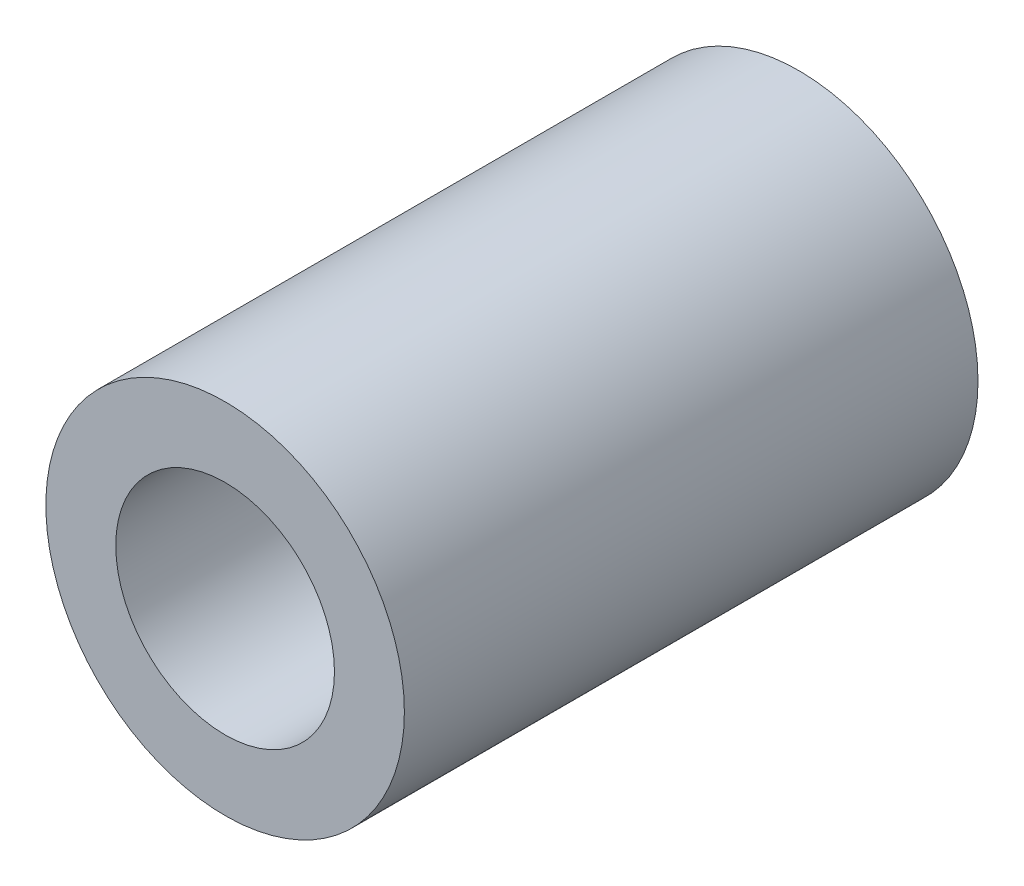
ISO-10303-21;
HEADER;
FILE_DESCRIPTION(('STEP AP214'),'2;1');
FILE_NAME('part.step','',(''),(''),'','','');
FILE_SCHEMA(('AUTOMOTIVE_DESIGN { 1 0 10303 214 1 1 1 1 }'));
ENDSEC;
DATA;
#1=APPLICATION_CONTEXT('core data for automotive mechanical design processes');
#2=APPLICATION_PROTOCOL_DEFINITION('international standard','automotive_design',2000,#1);
#3=PRODUCT_CONTEXT('',#1,'mechanical');
#4=PRODUCT('Part','Part','',(#3));
#5=PRODUCT_RELATED_PRODUCT_CATEGORY('part','',(#4));
#6=PRODUCT_DEFINITION_FORMATION('','',#4);
#7=PRODUCT_DEFINITION_CONTEXT('part definition',#1,'design');
#8=PRODUCT_DEFINITION('design','',#6,#7);
#9=PRODUCT_DEFINITION_SHAPE('','',#8);
#10=(LENGTH_UNIT() NAMED_UNIT(*) SI_UNIT(.MILLI.,.METRE.));
#11=(NAMED_UNIT(*) PLANE_ANGLE_UNIT() SI_UNIT($,.RADIAN.));
#12=(NAMED_UNIT(*) SI_UNIT($,.STERADIAN.) SOLID_ANGLE_UNIT());
#13=UNCERTAINTY_MEASURE_WITH_UNIT(LENGTH_MEASURE(1.E-05),#10,'distance_accuracy_value','');
#14=(GEOMETRIC_REPRESENTATION_CONTEXT(3) GLOBAL_UNCERTAINTY_ASSIGNED_CONTEXT((#13)) GLOBAL_UNIT_ASSIGNED_CONTEXT((#10,
#11,#12)) REPRESENTATION_CONTEXT('',''));
#15=CARTESIAN_POINT('',(0.,0.,0.));
#16=DIRECTION('',(0.,0.,1.));
#17=DIRECTION('',(1.,0.,0.));
#18=AXIS2_PLACEMENT_3D('',#15,#16,#17);
#19=CARTESIAN_POINT('',(0.,0.,16.));
#20=DIRECTION('',(0.,0.,1.));
#21=DIRECTION('',(1.,0.,0.));
#22=AXIS2_PLACEMENT_3D('',#19,#20,#21);
#23=PLANE('',#22);
#24=CARTESIAN_POINT('',(0.,0.,16.));
#25=DIRECTION('',(0.,0.,1.));
#26=DIRECTION('',(1.,0.,0.));
#27=AXIS2_PLACEMENT_3D('',#24,#25,#26);
#28=CIRCLE('',#27,5.);
#29=CARTESIAN_POINT('',(5.,0.,16.));
#30=VERTEX_POINT('',#29);
#31=EDGE_CURVE('E10',#30,#30,#28,.T.);
#32=ORIENTED_EDGE('',*,*,#31,.T.);
#33=EDGE_LOOP('',(#32));
#34=FACE_BOUND('',#33,.T.);
#35=CARTESIAN_POINT('',(0.,0.,16.));
#36=DIRECTION('',(0.,0.,1.));
#37=DIRECTION('',(1.,0.,0.));
#38=AXIS2_PLACEMENT_3D('',#35,#36,#37);
#39=CIRCLE('',#38,3.05);
#40=CARTESIAN_POINT('',(3.05,0.,16.));
#41=VERTEX_POINT('',#40);
#42=EDGE_CURVE('E50',#41,#41,#39,.T.);
#43=ORIENTED_EDGE('',*,*,#42,.F.);
#44=EDGE_LOOP('',(#43));
#45=FACE_BOUND('',#44,.T.);
#46=ADVANCED_FACE('F37',(#34,#45),#23,.T.);
#47=CARTESIAN_POINT('',(0.,0.,0.));
#48=DIRECTION('',(0.,0.,1.));
#49=DIRECTION('',(1.,0.,0.));
#50=AXIS2_PLACEMENT_3D('',#47,#48,#49);
#51=PLANE('',#50);
#52=CARTESIAN_POINT('',(0.,0.,0.));
#53=DIRECTION('',(0.,0.,1.));
#54=DIRECTION('',(1.,0.,0.));
#55=AXIS2_PLACEMENT_3D('',#52,#53,#54);
#56=CIRCLE('',#55,5.);
#57=CARTESIAN_POINT('',(5.,0.,0.));
#58=VERTEX_POINT('',#57);
#59=EDGE_CURVE('E41',#58,#58,#56,.T.);
#60=ORIENTED_EDGE('',*,*,#59,.F.);
#61=EDGE_LOOP('',(#60));
#62=FACE_BOUND('',#61,.T.);
#63=CARTESIAN_POINT('',(0.,0.,0.));
#64=DIRECTION('',(0.,0.,1.));
#65=DIRECTION('',(1.,0.,0.));
#66=AXIS2_PLACEMENT_3D('',#63,#64,#65);
#67=CIRCLE('',#66,3.05);
#68=CARTESIAN_POINT('',(3.05,0.,0.));
#69=VERTEX_POINT('',#68);
#70=EDGE_CURVE('E52',#69,#69,#67,.T.);
#71=ORIENTED_EDGE('',*,*,#70,.T.);
#72=EDGE_LOOP('',(#71));
#73=FACE_BOUND('',#72,.T.);
#74=ADVANCED_FACE('F64',(#62,#73),#51,.F.);
#75=CARTESIAN_POINT('',(0.,0.,16.));
#76=DIRECTION('',(0.,0.,-1.));
#77=DIRECTION('',(-1.,0.,0.));
#78=AXIS2_PLACEMENT_3D('',#75,#76,#77);
#79=CYLINDRICAL_SURFACE('',#78,5.);
#80=ORIENTED_EDGE('',*,*,#31,.F.);
#81=EDGE_LOOP('',(#80));
#82=FACE_BOUND('',#81,.T.);
#83=ORIENTED_EDGE('',*,*,#59,.T.);
#84=EDGE_LOOP('',(#83));
#85=FACE_BOUND('',#84,.T.);
#86=ADVANCED_FACE('F39',(#82,#85),#79,.T.);
#87=CARTESIAN_POINT('',(0.,0.,16.));
#88=DIRECTION('',(0.,0.,-1.));
#89=DIRECTION('',(-1.,0.,0.));
#90=AXIS2_PLACEMENT_3D('',#87,#88,#89);
#91=CYLINDRICAL_SURFACE('',#90,3.05);
#92=ORIENTED_EDGE('',*,*,#42,.T.);
#93=EDGE_LOOP('',(#92));
#94=FACE_BOUND('',#93,.T.);
#95=ORIENTED_EDGE('',*,*,#70,.F.);
#96=EDGE_LOOP('',(#95));
#97=FACE_BOUND('',#96,.T.);
#98=ADVANCED_FACE('F60',(#94,#97),#91,.F.);
#99=CLOSED_SHELL('',(#46,#74,#86,#98));
#100=MANIFOLD_SOLID_BREP('B2',#99);
#101=ADVANCED_BREP_SHAPE_REPRESENTATION('',(#18,#100),#14);
#102=SHAPE_DEFINITION_REPRESENTATION(#9,#101);
ENDSEC;
END-ISO-10303-21;
